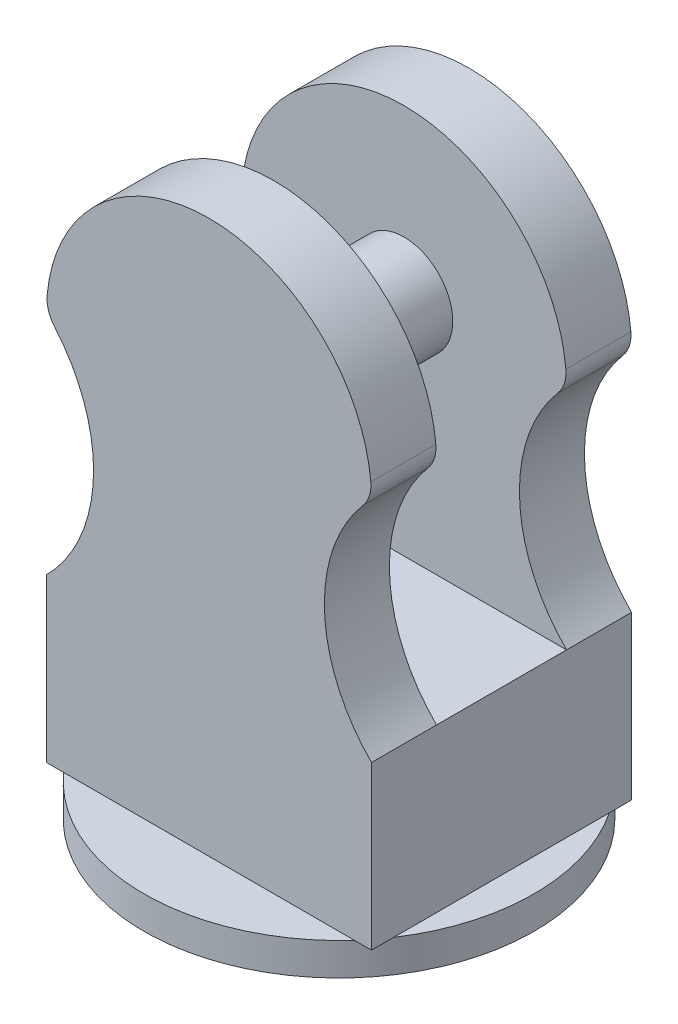
ISO-10303-21;
HEADER;
FILE_DESCRIPTION(('STEP AP214'),'2;1');
FILE_NAME('part.step','',(''),(''),'','','');
FILE_SCHEMA(('AUTOMOTIVE_DESIGN { 1 0 10303 214 1 1 1 1 }'));
ENDSEC;
DATA;
#1=APPLICATION_CONTEXT('core data for automotive mechanical design processes');
#2=APPLICATION_PROTOCOL_DEFINITION('international standard','automotive_design',2000,#1);
#3=PRODUCT_CONTEXT('',#1,'mechanical');
#4=PRODUCT('Part','Part','',(#3));
#5=PRODUCT_RELATED_PRODUCT_CATEGORY('part','',(#4));
#6=PRODUCT_DEFINITION_FORMATION('','',#4);
#7=PRODUCT_DEFINITION_CONTEXT('part definition',#1,'design');
#8=PRODUCT_DEFINITION('design','',#6,#7);
#9=PRODUCT_DEFINITION_SHAPE('','',#8);
#10=(LENGTH_UNIT() NAMED_UNIT(*) SI_UNIT(.MILLI.,.METRE.));
#11=(NAMED_UNIT(*) PLANE_ANGLE_UNIT() SI_UNIT($,.RADIAN.));
#12=(NAMED_UNIT(*) SI_UNIT($,.STERADIAN.) SOLID_ANGLE_UNIT());
#13=UNCERTAINTY_MEASURE_WITH_UNIT(LENGTH_MEASURE(1.E-05),#10,'distance_accuracy_value','');
#14=(GEOMETRIC_REPRESENTATION_CONTEXT(3) GLOBAL_UNCERTAINTY_ASSIGNED_CONTEXT((#13)) GLOBAL_UNIT_ASSIGNED_CONTEXT((#10,
#11,#12)) REPRESENTATION_CONTEXT('',''));
#15=CARTESIAN_POINT('',(0.,0.,0.));
#16=DIRECTION('',(0.,0.,1.));
#17=DIRECTION('',(1.,0.,0.));
#18=AXIS2_PLACEMENT_3D('',#15,#16,#17);
#19=CARTESIAN_POINT('',(50.,-120.,40.));
#20=DIRECTION('',(0.,-1.,0.));
#21=DIRECTION('',(0.,0.,-1.));
#22=AXIS2_PLACEMENT_3D('',#19,#20,#21);
#23=PLANE('',#22);
#24=CARTESIAN_POINT('',(0.,-120.,0.));
#25=DIRECTION('',(0.,-1.,0.));
#26=DIRECTION('',(0.,0.,-1.));
#27=AXIS2_PLACEMENT_3D('',#24,#25,#26);
#28=CIRCLE('',#27,60.);
#29=CARTESIAN_POINT('',(44.7213595499958,-120.,-40.));
#30=VERTEX_POINT('',#29);
#31=CARTESIAN_POINT('',(50.,-120.,-33.166247903554));
#32=VERTEX_POINT('',#31);
#33=EDGE_CURVE('E297',#30,#32,#28,.T.);
#34=ORIENTED_EDGE('',*,*,#33,.F.);
#35=DIRECTION('',(-1.,0.,0.));
#36=VECTOR('',#35,1.);
#37=CARTESIAN_POINT('',(50.,-120.,-40.));
#38=LINE('',#37,#36);
#39=CARTESIAN_POINT('',(50.,-120.,-40.));
#40=VERTEX_POINT('',#39);
#41=EDGE_CURVE('E289',#40,#30,#38,.T.);
#42=ORIENTED_EDGE('',*,*,#41,.F.);
#43=DIRECTION('',(0.,0.,-1.));
#44=VECTOR('',#43,1.);
#45=CARTESIAN_POINT('',(50.,-120.,40.));
#46=LINE('',#45,#44);
#47=EDGE_CURVE('E280',#32,#40,#46,.T.);
#48=ORIENTED_EDGE('',*,*,#47,.F.);
#49=EDGE_LOOP('',(#34,#42,#48));
#50=FACE_BOUND('',#49,.T.);
#51=ADVANCED_FACE('F48',(#50),#23,.T.);
#52=CARTESIAN_POINT('',(50.,-120.,33.166247903554));
#53=VERTEX_POINT('',#52);
#54=CARTESIAN_POINT('',(44.7213595499958,-120.,40.));
#55=VERTEX_POINT('',#54);
#56=EDGE_CURVE('E219',#53,#55,#28,.T.);
#57=ORIENTED_EDGE('',*,*,#56,.F.);
#58=CARTESIAN_POINT('',(50.,-120.,40.));
#59=VERTEX_POINT('',#58);
#60=EDGE_CURVE('E276',#59,#53,#46,.T.);
#61=ORIENTED_EDGE('',*,*,#60,.F.);
#62=DIRECTION('',(-1.,0.,0.));
#63=VECTOR('',#62,1.);
#64=CARTESIAN_POINT('',(50.,-120.,40.));
#65=LINE('',#64,#63);
#66=EDGE_CURVE('E200',#59,#55,#65,.T.);
#67=ORIENTED_EDGE('',*,*,#66,.T.);
#68=EDGE_LOOP('',(#57,#61,#67));
#69=FACE_BOUND('',#68,.T.);
#70=ADVANCED_FACE('F402',(#69),#23,.T.);
#71=CARTESIAN_POINT('',(-44.7213595499958,-120.,40.));
#72=VERTEX_POINT('',#71);
#73=CARTESIAN_POINT('',(-50.,-120.,33.166247903554));
#74=VERTEX_POINT('',#73);
#75=EDGE_CURVE('E368',#72,#74,#28,.T.);
#76=ORIENTED_EDGE('',*,*,#75,.F.);
#77=CARTESIAN_POINT('',(-50.,-120.,40.));
#78=VERTEX_POINT('',#77);
#79=EDGE_CURVE('E292',#72,#78,#65,.T.);
#80=ORIENTED_EDGE('',*,*,#79,.T.);
#81=DIRECTION('',(0.,0.,-1.));
#82=VECTOR('',#81,1.);
#83=CARTESIAN_POINT('',(-50.,-120.,40.));
#84=LINE('',#83,#82);
#85=EDGE_CURVE('E281',#78,#74,#84,.T.);
#86=ORIENTED_EDGE('',*,*,#85,.T.);
#87=EDGE_LOOP('',(#76,#80,#86));
#88=FACE_BOUND('',#87,.T.);
#89=ADVANCED_FACE('F382',(#88),#23,.T.);
#90=CARTESIAN_POINT('',(0.,0.,40.));
#91=DIRECTION('',(0.,0.,-1.));
#92=DIRECTION('',(-1.,0.,0.));
#93=AXIS2_PLACEMENT_3D('',#90,#91,#92);
#94=CYLINDRICAL_SURFACE('',#93,15.);
#95=CARTESIAN_POINT('',(0.,0.,20.));
#96=DIRECTION('',(0.,0.,1.));
#97=DIRECTION('',(1.,0.,0.));
#98=AXIS2_PLACEMENT_3D('',#95,#96,#97);
#99=CIRCLE('',#98,15.);
#100=CARTESIAN_POINT('',(15.,0.,20.));
#101=VERTEX_POINT('',#100);
#102=EDGE_CURVE('E204',#101,#101,#99,.T.);
#103=ORIENTED_EDGE('',*,*,#102,.F.);
#104=EDGE_LOOP('',(#103));
#105=FACE_BOUND('',#104,.T.);
#106=CARTESIAN_POINT('',(0.,0.,-20.));
#107=DIRECTION('',(0.,0.,-1.));
#108=DIRECTION('',(-1.,0.,0.));
#109=AXIS2_PLACEMENT_3D('',#106,#107,#108);
#110=CIRCLE('',#109,15.);
#111=CARTESIAN_POINT('',(-15.,0.,-20.));
#112=VERTEX_POINT('',#111);
#113=EDGE_CURVE('E212',#112,#112,#110,.T.);
#114=ORIENTED_EDGE('',*,*,#113,.F.);
#115=EDGE_LOOP('',(#114));
#116=FACE_BOUND('',#115,.T.);
#117=ADVANCED_FACE('F417',(#105,#116),#94,.T.);
#118=CARTESIAN_POINT('',(0.,0.,20.));
#119=DIRECTION('',(0.,0.,1.));
#120=DIRECTION('',(1.,0.,0.));
#121=AXIS2_PLACEMENT_3D('',#118,#119,#120);
#122=CYLINDRICAL_SURFACE('',#121,50.);
#123=CARTESIAN_POINT('',(0.,0.,40.));
#124=DIRECTION('',(0.,0.,1.));
#125=DIRECTION('',(1.,0.,0.));
#126=AXIS2_PLACEMENT_3D('',#123,#124,#125);
#127=CIRCLE('',#126,50.);
#128=CARTESIAN_POINT('',(49.7831979752132,4.65115032661008,40.));
#129=VERTEX_POINT('',#128);
#130=CARTESIAN_POINT('',(-49.7831979752132,4.65115032661009,40.));
#131=VERTEX_POINT('',#130);
#132=EDGE_CURVE('E206',#129,#131,#127,.T.);
#133=ORIENTED_EDGE('',*,*,#132,.F.);
#134=DIRECTION('',(0.,0.,1.));
#135=VECTOR('',#134,1.);
#136=CARTESIAN_POINT('',(49.7831979752132,4.65115032661008,20.));
#137=LINE('',#136,#135);
#138=CARTESIAN_POINT('',(49.7831979752132,4.65115032661008,20.));
#139=VERTEX_POINT('',#138);
#140=EDGE_CURVE('E240',#129,#139,#137,.F.);
#141=ORIENTED_EDGE('',*,*,#140,.T.);
#142=CARTESIAN_POINT('',(0.,0.,20.));
#143=DIRECTION('',(0.,0.,1.));
#144=DIRECTION('',(1.,0.,0.));
#145=AXIS2_PLACEMENT_3D('',#142,#143,#144);
#146=CIRCLE('',#145,50.);
#147=CARTESIAN_POINT('',(-49.7831979752132,4.65115032661009,20.));
#148=VERTEX_POINT('',#147);
#149=EDGE_CURVE('E201',#139,#148,#146,.T.);
#150=ORIENTED_EDGE('',*,*,#149,.T.);
#151=DIRECTION('',(0.,0.,1.));
#152=VECTOR('',#151,1.);
#153=CARTESIAN_POINT('',(-49.7831979752132,4.65115032661009,20.));
#154=LINE('',#153,#152);
#155=EDGE_CURVE('E237',#148,#131,#154,.T.);
#156=ORIENTED_EDGE('',*,*,#155,.T.);
#157=EDGE_LOOP('',(#133,#141,#150,#156));
#158=FACE_BOUND('',#157,.T.);
#159=ADVANCED_FACE('F257',(#158),#122,.T.);
#160=CARTESIAN_POINT('',(50.,0.,20.));
#161=DIRECTION('',(1.,0.,0.));
#162=DIRECTION('',(0.,1.,0.));
#163=AXIS2_PLACEMENT_3D('',#160,#161,#162);
#164=PLANE('',#163);
#165=DIRECTION('',(0.,0.,1.));
#166=VECTOR('',#165,1.);
#167=CARTESIAN_POINT('',(50.,-70.,-50.));
#168=LINE('',#167,#166);
#169=CARTESIAN_POINT('',(50.,-70.,20.));
#170=VERTEX_POINT('',#169);
#171=CARTESIAN_POINT('',(50.,-70.,40.));
#172=VERTEX_POINT('',#171);
#173=EDGE_CURVE('E179',#170,#172,#168,.T.);
#174=ORIENTED_EDGE('',*,*,#173,.T.);
#175=DIRECTION('',(0.,1.,0.));
#176=VECTOR('',#175,1.);
#177=CARTESIAN_POINT('',(50.,0.,40.));
#178=LINE('',#177,#176);
#179=EDGE_CURVE('E190',#59,#172,#178,.T.);
#180=ORIENTED_EDGE('',*,*,#179,.F.);
#181=ORIENTED_EDGE('',*,*,#60,.T.);
#182=EDGE_CURVE('E279',#53,#32,#46,.T.);
#183=ORIENTED_EDGE('',*,*,#182,.T.);
#184=ORIENTED_EDGE('',*,*,#47,.T.);
#185=DIRECTION('',(0.,-1.,0.));
#186=VECTOR('',#185,1.);
#187=CARTESIAN_POINT('',(50.,0.,-40.));
#188=LINE('',#187,#186);
#189=CARTESIAN_POINT('',(50.,-70.,-40.));
#190=VERTEX_POINT('',#189);
#191=EDGE_CURVE('E266',#190,#40,#188,.T.);
#192=ORIENTED_EDGE('',*,*,#191,.F.);
#193=CARTESIAN_POINT('',(50.,-70.,-20.));
#194=VERTEX_POINT('',#193);
#195=EDGE_CURVE('E195',#190,#194,#168,.T.);
#196=ORIENTED_EDGE('',*,*,#195,.T.);
#197=DIRECTION('',(0.,0.,-1.));
#198=VECTOR('',#197,1.);
#199=CARTESIAN_POINT('',(50.,-70.,40.));
#200=LINE('',#199,#198);
#201=EDGE_CURVE('E194',#170,#194,#200,.T.);
#202=ORIENTED_EDGE('',*,*,#201,.F.);
#203=EDGE_LOOP('',(#174,#180,#181,#183,#184,#192,#196,#202));
#204=FACE_BOUND('',#203,.T.);
#205=ADVANCED_FACE('F188',(#204),#164,.T.);
#206=CARTESIAN_POINT('',(-50.,0.,20.));
#207=DIRECTION('',(-1.,0.,0.));
#208=DIRECTION('',(0.,-1.,0.));
#209=AXIS2_PLACEMENT_3D('',#206,#207,#208);
#210=PLANE('',#209);
#211=DIRECTION('',(0.,0.,1.));
#212=VECTOR('',#211,1.);
#213=CARTESIAN_POINT('',(-50.,-70.,-50.));
#214=LINE('',#213,#212);
#215=CARTESIAN_POINT('',(-50.,-70.,-40.));
#216=VERTEX_POINT('',#215);
#217=CARTESIAN_POINT('',(-50.,-70.,-20.));
#218=VERTEX_POINT('',#217);
#219=EDGE_CURVE('E318',#216,#218,#214,.T.);
#220=ORIENTED_EDGE('',*,*,#219,.F.);
#221=DIRECTION('',(0.,1.,0.));
#222=VECTOR('',#221,1.);
#223=CARTESIAN_POINT('',(-50.,0.,-40.));
#224=LINE('',#223,#222);
#225=CARTESIAN_POINT('',(-50.,-120.,-40.));
#226=VERTEX_POINT('',#225);
#227=EDGE_CURVE('E261',#226,#216,#224,.T.);
#228=ORIENTED_EDGE('',*,*,#227,.F.);
#229=CARTESIAN_POINT('',(-50.,-120.,-33.166247903554));
#230=VERTEX_POINT('',#229);
#231=EDGE_CURVE('E278',#230,#226,#84,.T.);
#232=ORIENTED_EDGE('',*,*,#231,.F.);
#233=EDGE_CURVE('E285',#74,#230,#84,.T.);
#234=ORIENTED_EDGE('',*,*,#233,.F.);
#235=ORIENTED_EDGE('',*,*,#85,.F.);
#236=DIRECTION('',(0.,-1.,0.));
#237=VECTOR('',#236,1.);
#238=CARTESIAN_POINT('',(-50.,0.,40.));
#239=LINE('',#238,#237);
#240=CARTESIAN_POINT('',(-50.,-70.,40.));
#241=VERTEX_POINT('',#240);
#242=EDGE_CURVE('E202',#241,#78,#239,.T.);
#243=ORIENTED_EDGE('',*,*,#242,.F.);
#244=CARTESIAN_POINT('',(-50.,-70.,20.));
#245=VERTEX_POINT('',#244);
#246=EDGE_CURVE('E319',#245,#241,#214,.T.);
#247=ORIENTED_EDGE('',*,*,#246,.F.);
#248=DIRECTION('',(0.,0.,-1.));
#249=VECTOR('',#248,1.);
#250=CARTESIAN_POINT('',(-50.,-70.,40.));
#251=LINE('',#250,#249);
#252=EDGE_CURVE('E284',#245,#218,#251,.T.);
#253=ORIENTED_EDGE('',*,*,#252,.T.);
#254=EDGE_LOOP('',(#220,#228,#232,#234,#235,#243,#247,#253));
#255=FACE_BOUND('',#254,.T.);
#256=ADVANCED_FACE('F348',(#255),#210,.T.);
#257=CARTESIAN_POINT('',(0.,0.,20.));
#258=DIRECTION('',(0.,0.,1.));
#259=DIRECTION('',(1.,0.,0.));
#260=AXIS2_PLACEMENT_3D('',#257,#258,#259);
#261=PLANE('',#260);
#262=ORIENTED_EDGE('',*,*,#102,.T.);
#263=EDGE_LOOP('',(#262));
#264=FACE_BOUND('',#263,.T.);
#265=ORIENTED_EDGE('',*,*,#149,.F.);
#266=CARTESIAN_POINT('',(39.8265583801706,3.72092026128807,20.));
#267=DIRECTION('',(0.,0.,1.));
#268=DIRECTION('',(1.,0.,0.));
#269=AXIS2_PLACEMENT_3D('',#266,#267,#268);
#270=CIRCLE('',#269,10.);
#271=CARTESIAN_POINT('',(47.4190556853869,-2.78707364392446,20.));
#272=VERTEX_POINT('',#271);
#273=EDGE_CURVE('E243',#139,#272,#270,.F.);
#274=ORIENTED_EDGE('',*,*,#273,.T.);
#275=CARTESIAN_POINT('',(85.0000000000001,-35.,20.));
#276=DIRECTION('',(0.,0.,1.));
#277=DIRECTION('',(1.,0.,0.));
#278=AXIS2_PLACEMENT_3D('',#275,#276,#277);
#279=CIRCLE('',#278,49.4974746830584);
#280=EDGE_CURVE('E247',#272,#170,#279,.T.);
#281=ORIENTED_EDGE('',*,*,#280,.T.);
#282=DIRECTION('',(-1.,0.,0.));
#283=VECTOR('',#282,1.);
#284=CARTESIAN_POINT('',(0.,-70.,20.));
#285=LINE('',#284,#283);
#286=EDGE_CURVE('E270',#170,#245,#285,.T.);
#287=ORIENTED_EDGE('',*,*,#286,.T.);
#288=CARTESIAN_POINT('',(-85.0000000000001,-35.,20.));
#289=DIRECTION('',(0.,0.,1.));
#290=DIRECTION('',(1.,0.,0.));
#291=AXIS2_PLACEMENT_3D('',#288,#289,#290);
#292=CIRCLE('',#291,49.4974746830584);
#293=CARTESIAN_POINT('',(-47.4190556853869,-2.78707364392446,20.));
#294=VERTEX_POINT('',#293);
#295=EDGE_CURVE('E309',#245,#294,#292,.T.);
#296=ORIENTED_EDGE('',*,*,#295,.T.);
#297=CARTESIAN_POINT('',(-39.8265583801706,3.72092026128807,20.));
#298=DIRECTION('',(0.,0.,1.));
#299=DIRECTION('',(1.,0.,0.));
#300=AXIS2_PLACEMENT_3D('',#297,#298,#299);
#301=CIRCLE('',#300,10.);
#302=EDGE_CURVE('E69',#294,#148,#301,.F.);
#303=ORIENTED_EDGE('',*,*,#302,.T.);
#304=EDGE_LOOP('',(#265,#274,#281,#287,#296,#303));
#305=FACE_BOUND('',#304,.T.);
#306=ADVANCED_FACE('F245',(#264,#305),#261,.F.);
#307=CARTESIAN_POINT('',(0.,0.,40.));
#308=DIRECTION('',(0.,0.,1.));
#309=DIRECTION('',(1.,0.,0.));
#310=AXIS2_PLACEMENT_3D('',#307,#308,#309);
#311=PLANE('',#310);
#312=CARTESIAN_POINT('',(85.0000000000001,-35.,40.));
#313=DIRECTION('',(0.,0.,1.));
#314=DIRECTION('',(1.,0.,0.));
#315=AXIS2_PLACEMENT_3D('',#312,#313,#314);
#316=CIRCLE('',#315,49.4974746830584);
#317=CARTESIAN_POINT('',(47.4190556853869,-2.78707364392446,40.));
#318=VERTEX_POINT('',#317);
#319=EDGE_CURVE('E175',#318,#172,#316,.T.);
#320=ORIENTED_EDGE('',*,*,#319,.F.);
#321=CARTESIAN_POINT('',(39.8265583801706,3.72092026128807,40.));
#322=DIRECTION('',(0.,0.,1.));
#323=DIRECTION('',(1.,0.,0.));
#324=AXIS2_PLACEMENT_3D('',#321,#322,#323);
#325=CIRCLE('',#324,10.);
#326=EDGE_CURVE('E235',#318,#129,#325,.T.);
#327=ORIENTED_EDGE('',*,*,#326,.T.);
#328=ORIENTED_EDGE('',*,*,#132,.T.);
#329=CARTESIAN_POINT('',(-39.8265583801706,3.72092026128807,40.));
#330=DIRECTION('',(0.,0.,1.));
#331=DIRECTION('',(1.,0.,0.));
#332=AXIS2_PLACEMENT_3D('',#329,#330,#331);
#333=CIRCLE('',#332,10.);
#334=CARTESIAN_POINT('',(-47.4190556853869,-2.78707364392446,40.));
#335=VERTEX_POINT('',#334);
#336=EDGE_CURVE('E233',#131,#335,#333,.T.);
#337=ORIENTED_EDGE('',*,*,#336,.T.);
#338=CARTESIAN_POINT('',(-85.0000000000001,-35.,40.));
#339=DIRECTION('',(0.,0.,1.));
#340=DIRECTION('',(-1.,0.,0.));
#341=AXIS2_PLACEMENT_3D('',#338,#339,#340);
#342=CIRCLE('',#341,49.4974746830584);
#343=EDGE_CURVE('E250',#241,#335,#342,.T.);
#344=ORIENTED_EDGE('',*,*,#343,.F.);
#345=ORIENTED_EDGE('',*,*,#242,.T.);
#346=ORIENTED_EDGE('',*,*,#79,.F.);
#347=EDGE_CURVE('E296',#55,#72,#65,.T.);
#348=ORIENTED_EDGE('',*,*,#347,.F.);
#349=ORIENTED_EDGE('',*,*,#66,.F.);
#350=ORIENTED_EDGE('',*,*,#179,.T.);
#351=EDGE_LOOP('',(#320,#327,#328,#337,#344,#345,#346,#348,#349,#350));
#352=FACE_BOUND('',#351,.T.);
#353=ADVANCED_FACE('F198',(#352),#311,.T.);
#354=CARTESIAN_POINT('',(0.,0.,-20.));
#355=DIRECTION('',(0.,0.,-1.));
#356=DIRECTION('',(-1.,0.,0.));
#357=AXIS2_PLACEMENT_3D('',#354,#355,#356);
#358=CYLINDRICAL_SURFACE('',#357,50.);
#359=CARTESIAN_POINT('',(0.,0.,-20.));
#360=DIRECTION('',(0.,0.,-1.));
#361=DIRECTION('',(-1.,0.,0.));
#362=AXIS2_PLACEMENT_3D('',#359,#360,#361);
#363=CIRCLE('',#362,50.);
#364=CARTESIAN_POINT('',(-49.7831979752132,4.6511503266101,-20.));
#365=VERTEX_POINT('',#364);
#366=CARTESIAN_POINT('',(49.7831979752132,4.65115032661009,-20.));
#367=VERTEX_POINT('',#366);
#368=EDGE_CURVE('E259',#365,#367,#363,.T.);
#369=ORIENTED_EDGE('',*,*,#368,.T.);
#370=DIRECTION('',(0.,0.,-1.));
#371=VECTOR('',#370,1.);
#372=CARTESIAN_POINT('',(49.7831979752132,4.65115032661009,-20.));
#373=LINE('',#372,#371);
#374=CARTESIAN_POINT('',(49.7831979752132,4.65115032661009,-40.));
#375=VERTEX_POINT('',#374);
#376=EDGE_CURVE('E218',#367,#375,#373,.T.);
#377=ORIENTED_EDGE('',*,*,#376,.T.);
#378=CARTESIAN_POINT('',(0.,0.,-40.));
#379=DIRECTION('',(0.,0.,-1.));
#380=DIRECTION('',(-1.,0.,0.));
#381=AXIS2_PLACEMENT_3D('',#378,#379,#380);
#382=CIRCLE('',#381,50.);
#383=CARTESIAN_POINT('',(-49.7831979752132,4.6511503266101,-40.));
#384=VERTEX_POINT('',#383);
#385=EDGE_CURVE('E268',#384,#375,#382,.T.);
#386=ORIENTED_EDGE('',*,*,#385,.F.);
#387=DIRECTION('',(0.,0.,-1.));
#388=VECTOR('',#387,1.);
#389=CARTESIAN_POINT('',(-49.7831979752132,4.6511503266101,-20.));
#390=LINE('',#389,#388);
#391=EDGE_CURVE('E216',#384,#365,#390,.F.);
#392=ORIENTED_EDGE('',*,*,#391,.T.);
#393=EDGE_LOOP('',(#369,#377,#386,#392));
#394=FACE_BOUND('',#393,.T.);
#395=ADVANCED_FACE('F546',(#394),#358,.T.);
#396=CARTESIAN_POINT('',(0.,0.,-20.));
#397=DIRECTION('',(0.,0.,-1.));
#398=DIRECTION('',(-1.,0.,0.));
#399=AXIS2_PLACEMENT_3D('',#396,#397,#398);
#400=PLANE('',#399);
#401=ORIENTED_EDGE('',*,*,#113,.T.);
#402=EDGE_LOOP('',(#401));
#403=FACE_BOUND('',#402,.T.);
#404=CARTESIAN_POINT('',(85.0000000000001,-35.,-20.));
#405=DIRECTION('',(0.,0.,-1.));
#406=DIRECTION('',(-1.,0.,0.));
#407=AXIS2_PLACEMENT_3D('',#404,#405,#406);
#408=CIRCLE('',#407,49.4974746830584);
#409=CARTESIAN_POINT('',(47.4190556853869,-2.78707364392446,-20.));
#410=VERTEX_POINT('',#409);
#411=EDGE_CURVE('E251',#194,#410,#408,.T.);
#412=ORIENTED_EDGE('',*,*,#411,.T.);
#413=CARTESIAN_POINT('',(39.8265583801706,3.72092026128807,-20.));
#414=DIRECTION('',(0.,0.,-1.));
#415=DIRECTION('',(-1.,0.,0.));
#416=AXIS2_PLACEMENT_3D('',#413,#414,#415);
#417=CIRCLE('',#416,10.);
#418=EDGE_CURVE('E230',#410,#367,#417,.F.);
#419=ORIENTED_EDGE('',*,*,#418,.T.);
#420=ORIENTED_EDGE('',*,*,#368,.F.);
#421=CARTESIAN_POINT('',(-39.8265583801706,3.72092026128808,-20.));
#422=DIRECTION('',(0.,0.,-1.));
#423=DIRECTION('',(-1.,0.,0.));
#424=AXIS2_PLACEMENT_3D('',#421,#422,#423);
#425=CIRCLE('',#424,10.);
#426=CARTESIAN_POINT('',(-47.4190556853869,-2.78707364392446,-20.));
#427=VERTEX_POINT('',#426);
#428=EDGE_CURVE('E228',#365,#427,#425,.F.);
#429=ORIENTED_EDGE('',*,*,#428,.T.);
#430=CARTESIAN_POINT('',(-85.0000000000001,-35.,-20.));
#431=DIRECTION('',(0.,0.,-1.));
#432=DIRECTION('',(-1.,0.,0.));
#433=AXIS2_PLACEMENT_3D('',#430,#431,#432);
#434=CIRCLE('',#433,49.4974746830584);
#435=EDGE_CURVE('E313',#427,#218,#434,.T.);
#436=ORIENTED_EDGE('',*,*,#435,.T.);
#437=DIRECTION('',(1.,0.,0.));
#438=VECTOR('',#437,1.);
#439=CARTESIAN_POINT('',(0.,-70.,-20.));
#440=LINE('',#439,#438);
#441=EDGE_CURVE('E273',#218,#194,#440,.T.);
#442=ORIENTED_EDGE('',*,*,#441,.T.);
#443=EDGE_LOOP('',(#412,#419,#420,#429,#436,#442));
#444=FACE_BOUND('',#443,.T.);
#445=ADVANCED_FACE('F336',(#403,#444),#400,.F.);
#446=CARTESIAN_POINT('',(0.,0.,-40.));
#447=DIRECTION('',(0.,0.,1.));
#448=DIRECTION('',(1.,0.,0.));
#449=AXIS2_PLACEMENT_3D('',#446,#447,#448);
#450=PLANE('',#449);
#451=ORIENTED_EDGE('',*,*,#385,.T.);
#452=CARTESIAN_POINT('',(39.8265583801706,3.72092026128807,-40.));
#453=DIRECTION('',(0.,0.,1.));
#454=DIRECTION('',(1.,0.,0.));
#455=AXIS2_PLACEMENT_3D('',#452,#453,#454);
#456=CIRCLE('',#455,10.);
#457=CARTESIAN_POINT('',(47.4190556853869,-2.78707364392446,-40.));
#458=VERTEX_POINT('',#457);
#459=EDGE_CURVE('E224',#375,#458,#456,.F.);
#460=ORIENTED_EDGE('',*,*,#459,.T.);
#461=CARTESIAN_POINT('',(85.0000000000001,-35.,-40.));
#462=DIRECTION('',(0.,0.,1.));
#463=DIRECTION('',(1.,0.,0.));
#464=AXIS2_PLACEMENT_3D('',#461,#462,#463);
#465=CIRCLE('',#464,49.4974746830584);
#466=EDGE_CURVE('E324',#458,#190,#465,.T.);
#467=ORIENTED_EDGE('',*,*,#466,.T.);
#468=ORIENTED_EDGE('',*,*,#191,.T.);
#469=ORIENTED_EDGE('',*,*,#41,.T.);
#470=CARTESIAN_POINT('',(-44.7213595499958,-120.,-40.));
#471=VERTEX_POINT('',#470);
#472=EDGE_CURVE('E293',#30,#471,#38,.T.);
#473=ORIENTED_EDGE('',*,*,#472,.T.);
#474=EDGE_CURVE('E294',#471,#226,#38,.T.);
#475=ORIENTED_EDGE('',*,*,#474,.T.);
#476=ORIENTED_EDGE('',*,*,#227,.T.);
#477=CARTESIAN_POINT('',(-85.0000000000001,-35.,-40.));
#478=DIRECTION('',(0.,0.,1.));
#479=DIRECTION('',(1.,0.,0.));
#480=AXIS2_PLACEMENT_3D('',#477,#478,#479);
#481=CIRCLE('',#480,49.4974746830584);
#482=CARTESIAN_POINT('',(-47.4190556853869,-2.78707364392446,-40.));
#483=VERTEX_POINT('',#482);
#484=EDGE_CURVE('E315',#216,#483,#481,.T.);
#485=ORIENTED_EDGE('',*,*,#484,.T.);
#486=CARTESIAN_POINT('',(-39.8265583801706,3.72092026128808,-40.));
#487=DIRECTION('',(0.,0.,1.));
#488=DIRECTION('',(1.,0.,0.));
#489=AXIS2_PLACEMENT_3D('',#486,#487,#488);
#490=CIRCLE('',#489,10.);
#491=EDGE_CURVE('E222',#483,#384,#490,.F.);
#492=ORIENTED_EDGE('',*,*,#491,.T.);
#493=EDGE_LOOP('',(#451,#460,#467,#468,#469,#473,#475,#476,#485,#492));
#494=FACE_BOUND('',#493,.T.);
#495=ADVANCED_FACE('F352',(#494),#450,.F.);
#496=CARTESIAN_POINT('',(50.,-70.,40.));
#497=DIRECTION('',(0.,1.,0.));
#498=DIRECTION('',(0.,0.,1.));
#499=AXIS2_PLACEMENT_3D('',#496,#497,#498);
#500=PLANE('',#499);
#501=ORIENTED_EDGE('',*,*,#286,.F.);
#502=ORIENTED_EDGE('',*,*,#201,.T.);
#503=ORIENTED_EDGE('',*,*,#441,.F.);
#504=ORIENTED_EDGE('',*,*,#252,.F.);
#505=EDGE_LOOP('',(#501,#502,#503,#504));
#506=FACE_BOUND('',#505,.T.);
#507=ADVANCED_FACE('F333',(#506),#500,.T.);
#508=EDGE_CURVE('E215',#230,#471,#28,.T.);
#509=ORIENTED_EDGE('',*,*,#508,.F.);
#510=ORIENTED_EDGE('',*,*,#231,.T.);
#511=ORIENTED_EDGE('',*,*,#474,.F.);
#512=EDGE_LOOP('',(#509,#510,#511));
#513=FACE_BOUND('',#512,.T.);
#514=ADVANCED_FACE('F357',(#513),#23,.T.);
#515=CARTESIAN_POINT('',(0.,-120.,0.));
#516=DIRECTION('',(0.,-1.,0.));
#517=DIRECTION('',(0.,0.,-1.));
#518=AXIS2_PLACEMENT_3D('',#515,#516,#517);
#519=PLANE('',#518);
#520=ORIENTED_EDGE('',*,*,#472,.F.);
#521=EDGE_CURVE('E302',#471,#30,#28,.T.);
#522=ORIENTED_EDGE('',*,*,#521,.F.);
#523=EDGE_LOOP('',(#520,#522));
#524=FACE_BOUND('',#523,.T.);
#525=ADVANCED_FACE('F361',(#524),#519,.F.);
#526=EDGE_CURVE('E372',#55,#72,#28,.T.);
#527=ORIENTED_EDGE('',*,*,#526,.F.);
#528=ORIENTED_EDGE('',*,*,#347,.T.);
#529=EDGE_LOOP('',(#527,#528));
#530=FACE_BOUND('',#529,.T.);
#531=ADVANCED_FACE('F377',(#530),#519,.F.);
#532=EDGE_CURVE('E363',#74,#230,#28,.T.);
#533=ORIENTED_EDGE('',*,*,#532,.F.);
#534=ORIENTED_EDGE('',*,*,#233,.T.);
#535=EDGE_LOOP('',(#533,#534));
#536=FACE_BOUND('',#535,.T.);
#537=ADVANCED_FACE('F386',(#536),#519,.F.);
#538=CARTESIAN_POINT('',(0.,-130.,0.));
#539=DIRECTION('',(0.,1.,0.));
#540=DIRECTION('',(0.,0.,1.));
#541=AXIS2_PLACEMENT_3D('',#538,#539,#540);
#542=CYLINDRICAL_SURFACE('',#541,60.);
#543=CARTESIAN_POINT('',(0.,-130.,0.));
#544=DIRECTION('',(0.,-1.,0.));
#545=DIRECTION('',(0.,0.,-1.));
#546=AXIS2_PLACEMENT_3D('',#543,#544,#545);
#547=CIRCLE('',#546,60.);
#548=CARTESIAN_POINT('',(0.,-130.,-60.));
#549=VERTEX_POINT('',#548);
#550=EDGE_CURVE('E300',#549,#549,#547,.T.);
#551=ORIENTED_EDGE('',*,*,#550,.F.);
#552=EDGE_LOOP('',(#551));
#553=FACE_BOUND('',#552,.T.);
#554=ORIENTED_EDGE('',*,*,#33,.T.);
#555=EDGE_CURVE('E301',#32,#53,#28,.T.);
#556=ORIENTED_EDGE('',*,*,#555,.T.);
#557=ORIENTED_EDGE('',*,*,#56,.T.);
#558=ORIENTED_EDGE('',*,*,#526,.T.);
#559=ORIENTED_EDGE('',*,*,#75,.T.);
#560=ORIENTED_EDGE('',*,*,#532,.T.);
#561=ORIENTED_EDGE('',*,*,#508,.T.);
#562=ORIENTED_EDGE('',*,*,#521,.T.);
#563=EDGE_LOOP('',(#554,#556,#557,#558,#559,#560,#561,#562));
#564=FACE_BOUND('',#563,.T.);
#565=ADVANCED_FACE('F365',(#553,#564),#542,.T.);
#566=CARTESIAN_POINT('',(0.,-130.,0.));
#567=DIRECTION('',(0.,-1.,0.));
#568=DIRECTION('',(0.,0.,-1.));
#569=AXIS2_PLACEMENT_3D('',#566,#567,#568);
#570=PLANE('',#569);
#571=CARTESIAN_POINT('',(0.,-130.,0.));
#572=DIRECTION('',(0.,-1.,0.));
#573=DIRECTION('',(0.,0.,-1.));
#574=AXIS2_PLACEMENT_3D('',#571,#572,#573);
#575=CIRCLE('',#574,15.);
#576=CARTESIAN_POINT('',(0.,-130.,-15.));
#577=VERTEX_POINT('',#576);
#578=EDGE_CURVE('E305',#577,#577,#575,.T.);
#579=ORIENTED_EDGE('',*,*,#578,.F.);
#580=EDGE_LOOP('',(#579));
#581=FACE_BOUND('',#580,.T.);
#582=ORIENTED_EDGE('',*,*,#550,.T.);
#583=EDGE_LOOP('',(#582));
#584=FACE_BOUND('',#583,.T.);
#585=ADVANCED_FACE('F394',(#581,#584),#570,.T.);
#586=ORIENTED_EDGE('',*,*,#182,.F.);
#587=ORIENTED_EDGE('',*,*,#555,.F.);
#588=EDGE_LOOP('',(#586,#587));
#589=FACE_BOUND('',#588,.T.);
#590=ADVANCED_FACE('F389',(#589),#519,.F.);
#591=CARTESIAN_POINT('',(0.,-120.,0.));
#592=DIRECTION('',(0.,-1.,0.));
#593=DIRECTION('',(0.,0.,-1.));
#594=AXIS2_PLACEMENT_3D('',#591,#592,#593);
#595=CYLINDRICAL_SURFACE('',#594,15.);
#596=CARTESIAN_POINT('',(0.,-120.,0.));
#597=DIRECTION('',(0.,-1.,0.));
#598=DIRECTION('',(0.,0.,-1.));
#599=AXIS2_PLACEMENT_3D('',#596,#597,#598);
#600=CIRCLE('',#599,15.);
#601=CARTESIAN_POINT('',(0.,-120.,-15.));
#602=VERTEX_POINT('',#601);
#603=EDGE_CURVE('E308',#602,#602,#600,.T.);
#604=ORIENTED_EDGE('',*,*,#603,.F.);
#605=EDGE_LOOP('',(#604));
#606=FACE_BOUND('',#605,.T.);
#607=ORIENTED_EDGE('',*,*,#578,.T.);
#608=EDGE_LOOP('',(#607));
#609=FACE_BOUND('',#608,.T.);
#610=ADVANCED_FACE('F399',(#606,#609),#595,.F.);
#611=CARTESIAN_POINT('',(0.,-120.,0.));
#612=DIRECTION('',(0.,-1.,0.));
#613=DIRECTION('',(0.,0.,-1.));
#614=AXIS2_PLACEMENT_3D('',#611,#612,#613);
#615=PLANE('',#614);
#616=ORIENTED_EDGE('',*,*,#603,.T.);
#617=EDGE_LOOP('',(#616));
#618=FACE_BOUND('',#617,.T.);
#619=ADVANCED_FACE('F454',(#618),#615,.T.);
#620=CARTESIAN_POINT('',(-85.0000000000001,-35.,-50.));
#621=DIRECTION('',(0.,0.,1.));
#622=DIRECTION('',(1.,0.,0.));
#623=AXIS2_PLACEMENT_3D('',#620,#621,#622);
#624=CYLINDRICAL_SURFACE('',#623,49.4974746830584);
#625=ORIENTED_EDGE('',*,*,#435,.F.);
#626=DIRECTION('',(0.,0.,1.));
#627=VECTOR('',#626,1.);
#628=CARTESIAN_POINT('',(-47.4190556853869,-2.78707364392445,-50.));
#629=LINE('',#628,#627);
#630=EDGE_CURVE('E13',#427,#483,#629,.F.);
#631=ORIENTED_EDGE('',*,*,#630,.T.);
#632=ORIENTED_EDGE('',*,*,#484,.F.);
#633=ORIENTED_EDGE('',*,*,#219,.T.);
#634=EDGE_LOOP('',(#625,#631,#632,#633));
#635=FACE_BOUND('',#634,.T.);
#636=ADVANCED_FACE('F345',(#635),#624,.F.);
#637=ORIENTED_EDGE('',*,*,#343,.T.);
#638=DIRECTION('',(0.,0.,1.));
#639=VECTOR('',#638,1.);
#640=CARTESIAN_POINT('',(-47.4190556853869,-2.78707364392446,-50.));
#641=LINE('',#640,#639);
#642=EDGE_CURVE('E56',#335,#294,#641,.F.);
#643=ORIENTED_EDGE('',*,*,#642,.T.);
#644=ORIENTED_EDGE('',*,*,#295,.F.);
#645=ORIENTED_EDGE('',*,*,#246,.T.);
#646=EDGE_LOOP('',(#637,#643,#644,#645));
#647=FACE_BOUND('',#646,.T.);
#648=ADVANCED_FACE('F445',(#647),#624,.F.);
#649=CARTESIAN_POINT('',(85.0000000000001,-35.,-50.));
#650=DIRECTION('',(0.,0.,1.));
#651=DIRECTION('',(1.,0.,0.));
#652=AXIS2_PLACEMENT_3D('',#649,#650,#651);
#653=CYLINDRICAL_SURFACE('',#652,49.4974746830584);
#654=ORIENTED_EDGE('',*,*,#466,.F.);
#655=DIRECTION('',(0.,0.,1.));
#656=VECTOR('',#655,1.);
#657=CARTESIAN_POINT('',(47.4190556853869,-2.78707364392446,-50.));
#658=LINE('',#657,#656);
#659=EDGE_CURVE('E226',#458,#410,#658,.T.);
#660=ORIENTED_EDGE('',*,*,#659,.T.);
#661=ORIENTED_EDGE('',*,*,#411,.F.);
#662=ORIENTED_EDGE('',*,*,#195,.F.);
#663=EDGE_LOOP('',(#654,#660,#661,#662));
#664=FACE_BOUND('',#663,.T.);
#665=ADVANCED_FACE('F447',(#664),#653,.F.);
#666=ORIENTED_EDGE('',*,*,#280,.F.);
#667=DIRECTION('',(0.,0.,1.));
#668=VECTOR('',#667,1.);
#669=CARTESIAN_POINT('',(47.4190556853869,-2.78707364392445,-50.));
#670=LINE('',#669,#668);
#671=EDGE_CURVE('E182',#272,#318,#670,.T.);
#672=ORIENTED_EDGE('',*,*,#671,.T.);
#673=ORIENTED_EDGE('',*,*,#319,.T.);
#674=ORIENTED_EDGE('',*,*,#173,.F.);
#675=EDGE_LOOP('',(#666,#672,#673,#674));
#676=FACE_BOUND('',#675,.T.);
#677=ADVANCED_FACE('F178',(#676),#653,.F.);
#678=CARTESIAN_POINT('',(39.8265583801706,3.72092026128807,-50.));
#679=DIRECTION('',(0.,0.,1.));
#680=DIRECTION('',(1.,0.,0.));
#681=AXIS2_PLACEMENT_3D('',#678,#679,#680);
#682=CYLINDRICAL_SURFACE('',#681,10.);
#683=ORIENTED_EDGE('',*,*,#418,.F.);
#684=ORIENTED_EDGE('',*,*,#659,.F.);
#685=ORIENTED_EDGE('',*,*,#459,.F.);
#686=ORIENTED_EDGE('',*,*,#376,.F.);
#687=EDGE_LOOP('',(#683,#684,#685,#686));
#688=FACE_BOUND('',#687,.T.);
#689=ADVANCED_FACE('F432',(#688),#682,.T.);
#690=CARTESIAN_POINT('',(39.8265583801706,3.72092026128807,20.));
#691=DIRECTION('',(0.,0.,-1.));
#692=DIRECTION('',(-1.,0.,0.));
#693=AXIS2_PLACEMENT_3D('',#690,#691,#692);
#694=CYLINDRICAL_SURFACE('',#693,10.);
#695=ORIENTED_EDGE('',*,*,#273,.F.);
#696=ORIENTED_EDGE('',*,*,#140,.F.);
#697=ORIENTED_EDGE('',*,*,#326,.F.);
#698=ORIENTED_EDGE('',*,*,#671,.F.);
#699=EDGE_LOOP('',(#695,#696,#697,#698));
#700=FACE_BOUND('',#699,.T.);
#701=ADVANCED_FACE('F253',(#700),#694,.T.);
#702=CARTESIAN_POINT('',(-39.8265583801706,3.72092026128807,-50.));
#703=DIRECTION('',(0.,0.,-1.));
#704=DIRECTION('',(-1.,0.,0.));
#705=AXIS2_PLACEMENT_3D('',#702,#703,#704);
#706=CYLINDRICAL_SURFACE('',#705,10.);
#707=ORIENTED_EDGE('',*,*,#302,.F.);
#708=ORIENTED_EDGE('',*,*,#642,.F.);
#709=ORIENTED_EDGE('',*,*,#336,.F.);
#710=ORIENTED_EDGE('',*,*,#155,.F.);
#711=EDGE_LOOP('',(#707,#708,#709,#710));
#712=FACE_BOUND('',#711,.T.);
#713=ADVANCED_FACE('F437',(#712),#706,.T.);
#714=CARTESIAN_POINT('',(-39.8265583801706,3.72092026128808,-20.));
#715=DIRECTION('',(0.,0.,1.));
#716=DIRECTION('',(1.,0.,0.));
#717=AXIS2_PLACEMENT_3D('',#714,#715,#716);
#718=CYLINDRICAL_SURFACE('',#717,10.);
#719=ORIENTED_EDGE('',*,*,#428,.F.);
#720=ORIENTED_EDGE('',*,*,#391,.F.);
#721=ORIENTED_EDGE('',*,*,#491,.F.);
#722=ORIENTED_EDGE('',*,*,#630,.F.);
#723=EDGE_LOOP('',(#719,#720,#721,#722));
#724=FACE_BOUND('',#723,.T.);
#725=ADVANCED_FACE('F50',(#724),#718,.T.);
#726=CLOSED_SHELL('',(#51,#70,#89,#117,#159,#205,#256,#306,#353,#395,#445,#495,#507,#514,#525,
#531,#537,#565,#585,#590,#610,#619,#636,#648,#665,#677,#689,#701,#713,#725));
#727=MANIFOLD_SOLID_BREP('B2',#726);
#728=ADVANCED_BREP_SHAPE_REPRESENTATION('',(#18,#727),#14);
#729=SHAPE_DEFINITION_REPRESENTATION(#9,#728);
ENDSEC;
END-ISO-10303-21;
